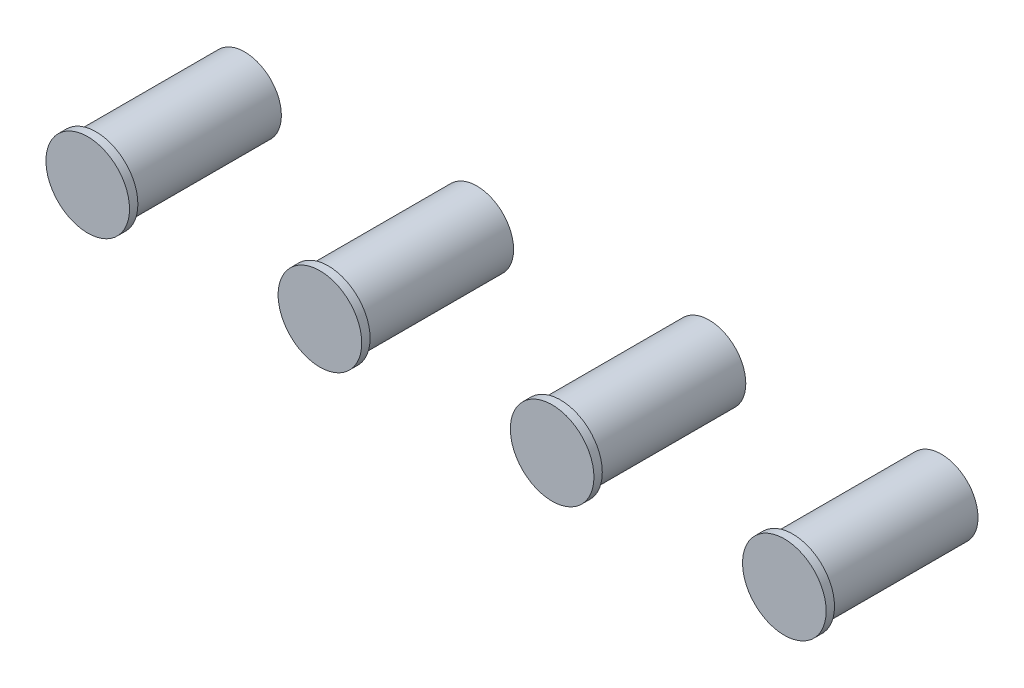
ISO-10303-21;
HEADER;
FILE_DESCRIPTION(('STEP AP214'),'2;1');
FILE_NAME('part.step','',(''),(''),'','','');
FILE_SCHEMA(('AUTOMOTIVE_DESIGN { 1 0 10303 214 1 1 1 1 }'));
ENDSEC;
DATA;
#1=APPLICATION_CONTEXT('core data for automotive mechanical design processes');
#2=APPLICATION_PROTOCOL_DEFINITION('international standard','automotive_design',2000,#1);
#3=PRODUCT_CONTEXT('',#1,'mechanical');
#4=PRODUCT('Part','Part','',(#3));
#5=PRODUCT_RELATED_PRODUCT_CATEGORY('part','',(#4));
#6=PRODUCT_DEFINITION_FORMATION('','',#4);
#7=PRODUCT_DEFINITION_CONTEXT('part definition',#1,'design');
#8=PRODUCT_DEFINITION('design','',#6,#7);
#9=PRODUCT_DEFINITION_SHAPE('','',#8);
#10=(LENGTH_UNIT() NAMED_UNIT(*) SI_UNIT(.MILLI.,.METRE.));
#11=(NAMED_UNIT(*) PLANE_ANGLE_UNIT() SI_UNIT($,.RADIAN.));
#12=(NAMED_UNIT(*) SI_UNIT($,.STERADIAN.) SOLID_ANGLE_UNIT());
#13=UNCERTAINTY_MEASURE_WITH_UNIT(LENGTH_MEASURE(1.E-05),#10,'distance_accuracy_value','');
#14=(GEOMETRIC_REPRESENTATION_CONTEXT(3) GLOBAL_UNCERTAINTY_ASSIGNED_CONTEXT((#13)) GLOBAL_UNIT_ASSIGNED_CONTEXT((#10,
#11,#12)) REPRESENTATION_CONTEXT('',''));
#15=CARTESIAN_POINT('',(0.,0.,0.));
#16=DIRECTION('',(0.,0.,1.));
#17=DIRECTION('',(1.,0.,0.));
#18=AXIS2_PLACEMENT_3D('',#15,#16,#17);
#19=CARTESIAN_POINT('',(75.,110.,0.));
#20=DIRECTION('',(0.,0.,-1.));
#21=DIRECTION('',(-1.,0.,0.));
#22=AXIS2_PLACEMENT_3D('',#19,#20,#21);
#23=CYLINDRICAL_SURFACE('',#22,7.9);
#24=CARTESIAN_POINT('',(75.,110.,0.));
#25=DIRECTION('',(0.,0.,1.));
#26=DIRECTION('',(1.,0.,0.));
#27=AXIS2_PLACEMENT_3D('',#24,#25,#26);
#28=CIRCLE('',#27,7.9);
#29=CARTESIAN_POINT('',(82.9,110.,0.));
#30=VERTEX_POINT('',#29);
#31=EDGE_CURVE('E55',#30,#30,#28,.T.);
#32=ORIENTED_EDGE('',*,*,#31,.F.);
#33=EDGE_LOOP('',(#32));
#34=FACE_BOUND('',#33,.T.);
#35=CARTESIAN_POINT('',(75.,110.,-32.));
#36=DIRECTION('',(0.,0.,1.));
#37=DIRECTION('',(1.,0.,0.));
#38=AXIS2_PLACEMENT_3D('',#35,#36,#37);
#39=CIRCLE('',#38,7.9);
#40=CARTESIAN_POINT('',(82.9,110.,-32.));
#41=VERTEX_POINT('',#40);
#42=EDGE_CURVE('E11',#41,#41,#39,.T.);
#43=ORIENTED_EDGE('',*,*,#42,.T.);
#44=EDGE_LOOP('',(#43));
#45=FACE_BOUND('',#44,.T.);
#46=ADVANCED_FACE('F48',(#34,#45),#23,.T.);
#47=CARTESIAN_POINT('',(75.,110.,-32.));
#48=DIRECTION('',(0.,0.,1.));
#49=DIRECTION('',(1.,0.,0.));
#50=AXIS2_PLACEMENT_3D('',#47,#48,#49);
#51=PLANE('',#50);
#52=ORIENTED_EDGE('',*,*,#42,.F.);
#53=EDGE_LOOP('',(#52));
#54=FACE_BOUND('',#53,.T.);
#55=ADVANCED_FACE('F49',(#54),#51,.F.);
#56=CARTESIAN_POINT('',(75.,110.,1.8));
#57=DIRECTION('',(0.,0.,-1.));
#58=DIRECTION('',(-1.,0.,0.));
#59=AXIS2_PLACEMENT_3D('',#56,#57,#58);
#60=CYLINDRICAL_SURFACE('',#59,8.99999999999999);
#61=CARTESIAN_POINT('',(75.,110.,1.8));
#62=DIRECTION('',(0.,0.,1.));
#63=DIRECTION('',(1.,0.,0.));
#64=AXIS2_PLACEMENT_3D('',#61,#62,#63);
#65=CIRCLE('',#64,8.99999999999999);
#66=CARTESIAN_POINT('',(84.,110.,1.8));
#67=VERTEX_POINT('',#66);
#68=EDGE_CURVE('E61',#67,#67,#65,.T.);
#69=ORIENTED_EDGE('',*,*,#68,.F.);
#70=EDGE_LOOP('',(#69));
#71=FACE_BOUND('',#70,.T.);
#72=CARTESIAN_POINT('',(75.,110.,0.));
#73=DIRECTION('',(0.,0.,1.));
#74=DIRECTION('',(1.,0.,0.));
#75=AXIS2_PLACEMENT_3D('',#72,#73,#74);
#76=CIRCLE('',#75,8.99999999999999);
#77=CARTESIAN_POINT('',(84.,110.,0.));
#78=VERTEX_POINT('',#77);
#79=EDGE_CURVE('E56',#78,#78,#76,.T.);
#80=ORIENTED_EDGE('',*,*,#79,.T.);
#81=EDGE_LOOP('',(#80));
#82=FACE_BOUND('',#81,.T.);
#83=ADVANCED_FACE('F66',(#71,#82),#60,.T.);
#84=CARTESIAN_POINT('',(75.,110.,1.8));
#85=DIRECTION('',(0.,0.,1.));
#86=DIRECTION('',(1.,0.,0.));
#87=AXIS2_PLACEMENT_3D('',#84,#85,#86);
#88=PLANE('',#87);
#89=ORIENTED_EDGE('',*,*,#68,.T.);
#90=EDGE_LOOP('',(#89));
#91=FACE_BOUND('',#90,.T.);
#92=ADVANCED_FACE('F72',(#91),#88,.T.);
#93=CARTESIAN_POINT('',(75.,110.,0.));
#94=DIRECTION('',(0.,0.,1.));
#95=DIRECTION('',(1.,0.,0.));
#96=AXIS2_PLACEMENT_3D('',#93,#94,#95);
#97=PLANE('',#96);
#98=ORIENTED_EDGE('',*,*,#31,.T.);
#99=EDGE_LOOP('',(#98));
#100=FACE_BOUND('',#99,.T.);
#101=ORIENTED_EDGE('',*,*,#79,.F.);
#102=EDGE_LOOP('',(#101));
#103=FACE_BOUND('',#102,.T.);
#104=ADVANCED_FACE('F68',(#100,#103),#97,.F.);
#105=CLOSED_SHELL('',(#46,#55,#83,#92,#104));
#106=MANIFOLD_SOLID_BREP('B2',#105);
#107=CARTESIAN_POINT('',(25.,110.,0.));
#108=DIRECTION('',(0.,0.,-1.));
#109=DIRECTION('',(-1.,0.,0.));
#110=AXIS2_PLACEMENT_3D('',#107,#108,#109);
#111=CYLINDRICAL_SURFACE('',#110,7.9);
#112=CARTESIAN_POINT('',(25.,110.,0.));
#113=DIRECTION('',(0.,0.,1.));
#114=DIRECTION('',(1.,0.,0.));
#115=AXIS2_PLACEMENT_3D('',#112,#113,#114);
#116=CIRCLE('',#115,7.9);
#117=CARTESIAN_POINT('',(32.9,110.,0.));
#118=VERTEX_POINT('',#117);
#119=EDGE_CURVE('E134',#118,#118,#116,.T.);
#120=ORIENTED_EDGE('',*,*,#119,.F.);
#121=EDGE_LOOP('',(#120));
#122=FACE_BOUND('',#121,.T.);
#123=CARTESIAN_POINT('',(25.,110.,-32.));
#124=DIRECTION('',(0.,0.,1.));
#125=DIRECTION('',(1.,0.,0.));
#126=AXIS2_PLACEMENT_3D('',#123,#124,#125);
#127=CIRCLE('',#126,7.9);
#128=CARTESIAN_POINT('',(32.9,110.,-32.));
#129=VERTEX_POINT('',#128);
#130=EDGE_CURVE('E50',#129,#129,#127,.T.);
#131=ORIENTED_EDGE('',*,*,#130,.T.);
#132=EDGE_LOOP('',(#131));
#133=FACE_BOUND('',#132,.T.);
#134=ADVANCED_FACE('F127',(#122,#133),#111,.T.);
#135=CARTESIAN_POINT('',(25.,110.,-32.));
#136=DIRECTION('',(0.,0.,1.));
#137=DIRECTION('',(1.,0.,0.));
#138=AXIS2_PLACEMENT_3D('',#135,#136,#137);
#139=PLANE('',#138);
#140=ORIENTED_EDGE('',*,*,#130,.F.);
#141=EDGE_LOOP('',(#140));
#142=FACE_BOUND('',#141,.T.);
#143=ADVANCED_FACE('F128',(#142),#139,.F.);
#144=CARTESIAN_POINT('',(25.,110.,1.8));
#145=DIRECTION('',(0.,0.,-1.));
#146=DIRECTION('',(-1.,0.,0.));
#147=AXIS2_PLACEMENT_3D('',#144,#145,#146);
#148=CYLINDRICAL_SURFACE('',#147,9.);
#149=CARTESIAN_POINT('',(25.,110.,1.8));
#150=DIRECTION('',(0.,0.,1.));
#151=DIRECTION('',(1.,0.,0.));
#152=AXIS2_PLACEMENT_3D('',#149,#150,#151);
#153=CIRCLE('',#152,9.);
#154=CARTESIAN_POINT('',(34.,110.,1.8));
#155=VERTEX_POINT('',#154);
#156=EDGE_CURVE('E138',#155,#155,#153,.T.);
#157=ORIENTED_EDGE('',*,*,#156,.F.);
#158=EDGE_LOOP('',(#157));
#159=FACE_BOUND('',#158,.T.);
#160=CARTESIAN_POINT('',(25.,110.,0.));
#161=DIRECTION('',(0.,0.,1.));
#162=DIRECTION('',(1.,0.,0.));
#163=AXIS2_PLACEMENT_3D('',#160,#161,#162);
#164=CIRCLE('',#163,9.);
#165=CARTESIAN_POINT('',(34.,110.,0.));
#166=VERTEX_POINT('',#165);
#167=EDGE_CURVE('E139',#166,#166,#164,.T.);
#168=ORIENTED_EDGE('',*,*,#167,.T.);
#169=EDGE_LOOP('',(#168));
#170=FACE_BOUND('',#169,.T.);
#171=ADVANCED_FACE('F146',(#159,#170),#148,.T.);
#172=CARTESIAN_POINT('',(25.,110.,1.8));
#173=DIRECTION('',(0.,0.,1.));
#174=DIRECTION('',(1.,0.,0.));
#175=AXIS2_PLACEMENT_3D('',#172,#173,#174);
#176=PLANE('',#175);
#177=ORIENTED_EDGE('',*,*,#156,.T.);
#178=EDGE_LOOP('',(#177));
#179=FACE_BOUND('',#178,.T.);
#180=ADVANCED_FACE('F150',(#179),#176,.T.);
#181=CARTESIAN_POINT('',(25.,110.,0.));
#182=DIRECTION('',(0.,0.,1.));
#183=DIRECTION('',(1.,0.,0.));
#184=AXIS2_PLACEMENT_3D('',#181,#182,#183);
#185=PLANE('',#184);
#186=ORIENTED_EDGE('',*,*,#119,.T.);
#187=EDGE_LOOP('',(#186));
#188=FACE_BOUND('',#187,.T.);
#189=ORIENTED_EDGE('',*,*,#167,.F.);
#190=EDGE_LOOP('',(#189));
#191=FACE_BOUND('',#190,.T.);
#192=ADVANCED_FACE('F149',(#188,#191),#185,.F.);
#193=CLOSED_SHELL('',(#134,#143,#171,#180,#192));
#194=MANIFOLD_SOLID_BREP('B6',#193);
#195=CARTESIAN_POINT('',(-25.,110.,0.));
#196=DIRECTION('',(0.,0.,-1.));
#197=DIRECTION('',(-1.,0.,0.));
#198=AXIS2_PLACEMENT_3D('',#195,#196,#197);
#199=CYLINDRICAL_SURFACE('',#198,7.9);
#200=CARTESIAN_POINT('',(-25.,110.,0.));
#201=DIRECTION('',(0.,0.,1.));
#202=DIRECTION('',(1.,0.,0.));
#203=AXIS2_PLACEMENT_3D('',#200,#201,#202);
#204=CIRCLE('',#203,7.9);
#205=CARTESIAN_POINT('',(-17.1,110.,0.));
#206=VERTEX_POINT('',#205);
#207=EDGE_CURVE('E209',#206,#206,#204,.T.);
#208=ORIENTED_EDGE('',*,*,#207,.F.);
#209=EDGE_LOOP('',(#208));
#210=FACE_BOUND('',#209,.T.);
#211=CARTESIAN_POINT('',(-25.,110.,-32.));
#212=DIRECTION('',(0.,0.,1.));
#213=DIRECTION('',(1.,0.,0.));
#214=AXIS2_PLACEMENT_3D('',#211,#212,#213);
#215=CIRCLE('',#214,7.9);
#216=CARTESIAN_POINT('',(-17.1,110.,-32.));
#217=VERTEX_POINT('',#216);
#218=EDGE_CURVE('E126',#217,#217,#215,.T.);
#219=ORIENTED_EDGE('',*,*,#218,.T.);
#220=EDGE_LOOP('',(#219));
#221=FACE_BOUND('',#220,.T.);
#222=ADVANCED_FACE('F203',(#210,#221),#199,.T.);
#223=CARTESIAN_POINT('',(-25.,110.,-32.));
#224=DIRECTION('',(0.,0.,1.));
#225=DIRECTION('',(1.,0.,0.));
#226=AXIS2_PLACEMENT_3D('',#223,#224,#225);
#227=PLANE('',#226);
#228=ORIENTED_EDGE('',*,*,#218,.F.);
#229=EDGE_LOOP('',(#228));
#230=FACE_BOUND('',#229,.T.);
#231=ADVANCED_FACE('F210',(#230),#227,.F.);
#232=CARTESIAN_POINT('',(-25.,110.,1.8));
#233=DIRECTION('',(0.,0.,-1.));
#234=DIRECTION('',(-1.,0.,0.));
#235=AXIS2_PLACEMENT_3D('',#232,#233,#234);
#236=CYLINDRICAL_SURFACE('',#235,9.);
#237=CARTESIAN_POINT('',(-25.,110.,1.8));
#238=DIRECTION('',(0.,0.,1.));
#239=DIRECTION('',(1.,0.,0.));
#240=AXIS2_PLACEMENT_3D('',#237,#238,#239);
#241=CIRCLE('',#240,9.);
#242=CARTESIAN_POINT('',(-16.,110.,1.8));
#243=VERTEX_POINT('',#242);
#244=EDGE_CURVE('E220',#243,#243,#241,.T.);
#245=ORIENTED_EDGE('',*,*,#244,.F.);
#246=EDGE_LOOP('',(#245));
#247=FACE_BOUND('',#246,.T.);
#248=CARTESIAN_POINT('',(-25.,110.,0.));
#249=DIRECTION('',(0.,0.,1.));
#250=DIRECTION('',(1.,0.,0.));
#251=AXIS2_PLACEMENT_3D('',#248,#249,#250);
#252=CIRCLE('',#251,9.);
#253=CARTESIAN_POINT('',(-16.,110.,0.));
#254=VERTEX_POINT('',#253);
#255=EDGE_CURVE('E219',#254,#254,#252,.T.);
#256=ORIENTED_EDGE('',*,*,#255,.T.);
#257=EDGE_LOOP('',(#256));
#258=FACE_BOUND('',#257,.T.);
#259=ADVANCED_FACE('F221',(#247,#258),#236,.T.);
#260=CARTESIAN_POINT('',(-25.,110.,1.8));
#261=DIRECTION('',(0.,0.,1.));
#262=DIRECTION('',(1.,0.,0.));
#263=AXIS2_PLACEMENT_3D('',#260,#261,#262);
#264=PLANE('',#263);
#265=ORIENTED_EDGE('',*,*,#244,.T.);
#266=EDGE_LOOP('',(#265));
#267=FACE_BOUND('',#266,.T.);
#268=ADVANCED_FACE('F226',(#267),#264,.T.);
#269=CARTESIAN_POINT('',(-25.,110.,0.));
#270=DIRECTION('',(0.,0.,1.));
#271=DIRECTION('',(1.,0.,0.));
#272=AXIS2_PLACEMENT_3D('',#269,#270,#271);
#273=PLANE('',#272);
#274=ORIENTED_EDGE('',*,*,#207,.T.);
#275=EDGE_LOOP('',(#274));
#276=FACE_BOUND('',#275,.T.);
#277=ORIENTED_EDGE('',*,*,#255,.F.);
#278=EDGE_LOOP('',(#277));
#279=FACE_BOUND('',#278,.T.);
#280=ADVANCED_FACE('F228',(#276,#279),#273,.F.);
#281=CLOSED_SHELL('',(#222,#231,#259,#268,#280));
#282=MANIFOLD_SOLID_BREP('B45',#281);
#283=CARTESIAN_POINT('',(-75.,110.,0.));
#284=DIRECTION('',(0.,0.,-1.));
#285=DIRECTION('',(-1.,0.,0.));
#286=AXIS2_PLACEMENT_3D('',#283,#284,#285);
#287=CYLINDRICAL_SURFACE('',#286,7.9);
#288=CARTESIAN_POINT('',(-75.,110.,0.));
#289=DIRECTION('',(0.,0.,1.));
#290=DIRECTION('',(1.,0.,0.));
#291=AXIS2_PLACEMENT_3D('',#288,#289,#290);
#292=CIRCLE('',#291,7.9);
#293=CARTESIAN_POINT('',(-67.1,110.,0.));
#294=VERTEX_POINT('',#293);
#295=EDGE_CURVE('E201',#294,#294,#292,.T.);
#296=ORIENTED_EDGE('',*,*,#295,.F.);
#297=EDGE_LOOP('',(#296));
#298=FACE_BOUND('',#297,.T.);
#299=CARTESIAN_POINT('',(-75.,110.,-32.));
#300=DIRECTION('',(0.,0.,1.));
#301=DIRECTION('',(1.,0.,0.));
#302=AXIS2_PLACEMENT_3D('',#299,#300,#301);
#303=CIRCLE('',#302,7.9);
#304=CARTESIAN_POINT('',(-67.1,110.,-32.));
#305=VERTEX_POINT('',#304);
#306=EDGE_CURVE('E278',#305,#305,#303,.T.);
#307=ORIENTED_EDGE('',*,*,#306,.T.);
#308=EDGE_LOOP('',(#307));
#309=FACE_BOUND('',#308,.T.);
#310=ADVANCED_FACE('F276',(#298,#309),#287,.T.);
#311=CARTESIAN_POINT('',(-75.,110.,-32.));
#312=DIRECTION('',(0.,0.,1.));
#313=DIRECTION('',(1.,0.,0.));
#314=AXIS2_PLACEMENT_3D('',#311,#312,#313);
#315=PLANE('',#314);
#316=ORIENTED_EDGE('',*,*,#306,.F.);
#317=EDGE_LOOP('',(#316));
#318=FACE_BOUND('',#317,.T.);
#319=ADVANCED_FACE('F299',(#318),#315,.F.);
#320=CARTESIAN_POINT('',(-75.,110.,1.8));
#321=DIRECTION('',(0.,0.,-1.));
#322=DIRECTION('',(-1.,0.,0.));
#323=AXIS2_PLACEMENT_3D('',#320,#321,#322);
#324=CYLINDRICAL_SURFACE('',#323,8.99999999999999);
#325=CARTESIAN_POINT('',(-75.,110.,1.8));
#326=DIRECTION('',(0.,0.,1.));
#327=DIRECTION('',(1.,0.,0.));
#328=AXIS2_PLACEMENT_3D('',#325,#326,#327);
#329=CIRCLE('',#328,8.99999999999999);
#330=CARTESIAN_POINT('',(-66.,110.,1.8));
#331=VERTEX_POINT('',#330);
#332=EDGE_CURVE('E287',#331,#331,#329,.T.);
#333=ORIENTED_EDGE('',*,*,#332,.F.);
#334=EDGE_LOOP('',(#333));
#335=FACE_BOUND('',#334,.T.);
#336=CARTESIAN_POINT('',(-75.,110.,0.));
#337=DIRECTION('',(0.,0.,1.));
#338=DIRECTION('',(1.,0.,0.));
#339=AXIS2_PLACEMENT_3D('',#336,#337,#338);
#340=CIRCLE('',#339,8.99999999999999);
#341=CARTESIAN_POINT('',(-66.,110.,0.));
#342=VERTEX_POINT('',#341);
#343=EDGE_CURVE('E289',#342,#342,#340,.T.);
#344=ORIENTED_EDGE('',*,*,#343,.T.);
#345=EDGE_LOOP('',(#344));
#346=FACE_BOUND('',#345,.T.);
#347=ADVANCED_FACE('F298',(#335,#346),#324,.T.);
#348=CARTESIAN_POINT('',(-75.,110.,1.8));
#349=DIRECTION('',(0.,0.,1.));
#350=DIRECTION('',(1.,0.,0.));
#351=AXIS2_PLACEMENT_3D('',#348,#349,#350);
#352=PLANE('',#351);
#353=ORIENTED_EDGE('',*,*,#332,.T.);
#354=EDGE_LOOP('',(#353));
#355=FACE_BOUND('',#354,.T.);
#356=ADVANCED_FACE('F295',(#355),#352,.T.);
#357=CARTESIAN_POINT('',(-75.,110.,0.));
#358=DIRECTION('',(0.,0.,1.));
#359=DIRECTION('',(1.,0.,0.));
#360=AXIS2_PLACEMENT_3D('',#357,#358,#359);
#361=PLANE('',#360);
#362=ORIENTED_EDGE('',*,*,#295,.T.);
#363=EDGE_LOOP('',(#362));
#364=FACE_BOUND('',#363,.T.);
#365=ORIENTED_EDGE('',*,*,#343,.F.);
#366=EDGE_LOOP('',(#365));
#367=FACE_BOUND('',#366,.T.);
#368=ADVANCED_FACE('F303',(#364,#367),#361,.F.);
#369=CLOSED_SHELL('',(#310,#319,#347,#356,#368));
#370=MANIFOLD_SOLID_BREP('B122',#369);
#371=ADVANCED_BREP_SHAPE_REPRESENTATION('',(#18,#106,#194,#282,#370),#14);
#372=SHAPE_DEFINITION_REPRESENTATION(#9,#371);
ENDSEC;
END-ISO-10303-21;
